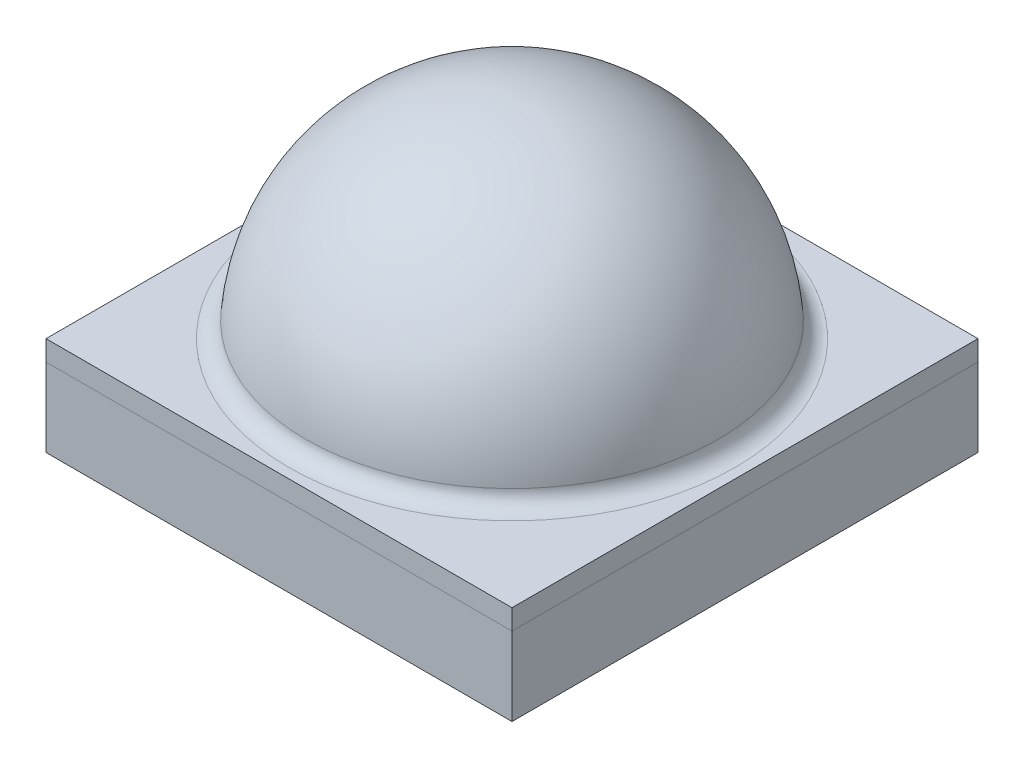
ISO-10303-21;
HEADER;
FILE_DESCRIPTION(('STEP AP214'),'2;1');
FILE_NAME('part.step','',(''),(''),'','','');
FILE_SCHEMA(('AUTOMOTIVE_DESIGN { 1 0 10303 214 1 1 1 1 }'));
ENDSEC;
DATA;
#1=APPLICATION_CONTEXT('core data for automotive mechanical design processes');
#2=APPLICATION_PROTOCOL_DEFINITION('international standard','automotive_design',2000,#1);
#3=PRODUCT_CONTEXT('',#1,'mechanical');
#4=PRODUCT('Part','Part','',(#3));
#5=PRODUCT_RELATED_PRODUCT_CATEGORY('part','',(#4));
#6=PRODUCT_DEFINITION_FORMATION('','',#4);
#7=PRODUCT_DEFINITION_CONTEXT('part definition',#1,'design');
#8=PRODUCT_DEFINITION('design','',#6,#7);
#9=PRODUCT_DEFINITION_SHAPE('','',#8);
#10=(LENGTH_UNIT() NAMED_UNIT(*) SI_UNIT(.MILLI.,.METRE.));
#11=(NAMED_UNIT(*) PLANE_ANGLE_UNIT() SI_UNIT($,.RADIAN.));
#12=(NAMED_UNIT(*) SI_UNIT($,.STERADIAN.) SOLID_ANGLE_UNIT());
#13=UNCERTAINTY_MEASURE_WITH_UNIT(LENGTH_MEASURE(1.E-05),#10,'distance_accuracy_value','');
#14=(GEOMETRIC_REPRESENTATION_CONTEXT(3) GLOBAL_UNCERTAINTY_ASSIGNED_CONTEXT((#13)) GLOBAL_UNIT_ASSIGNED_CONTEXT((#10,
#11,#12)) REPRESENTATION_CONTEXT('',''));
#15=CARTESIAN_POINT('',(0.,0.,0.));
#16=DIRECTION('',(0.,0.,1.));
#17=DIRECTION('',(1.,0.,0.));
#18=AXIS2_PLACEMENT_3D('',#15,#16,#17);
#19=CARTESIAN_POINT('',(1.725,0.73,-1.725));
#20=DIRECTION('',(-1.,0.,0.));
#21=DIRECTION('',(0.,0.,1.));
#22=AXIS2_PLACEMENT_3D('',#19,#20,#21);
#23=PLANE('',#22);
#24=DIRECTION('',(0.,0.,-1.));
#25=VECTOR('',#24,1.);
#26=CARTESIAN_POINT('',(1.725,0.58,-1.725));
#27=LINE('',#26,#25);
#28=CARTESIAN_POINT('',(1.725,0.58,1.725));
#29=VERTEX_POINT('',#28);
#30=CARTESIAN_POINT('',(1.725,0.58,-1.725));
#31=VERTEX_POINT('',#30);
#32=EDGE_CURVE('E115',#29,#31,#27,.T.);
#33=ORIENTED_EDGE('',*,*,#32,.T.);
#34=DIRECTION('',(0.,-1.,0.));
#35=VECTOR('',#34,1.);
#36=CARTESIAN_POINT('',(1.725,0.73,-1.725));
#37=LINE('',#36,#35);
#38=CARTESIAN_POINT('',(1.725,0.73,-1.725));
#39=VERTEX_POINT('',#38);
#40=EDGE_CURVE('E106',#39,#31,#37,.T.);
#41=ORIENTED_EDGE('',*,*,#40,.F.);
#42=DIRECTION('',(0.,0.,-1.));
#43=VECTOR('',#42,1.);
#44=CARTESIAN_POINT('',(1.725,0.73,-1.725));
#45=LINE('',#44,#43);
#46=CARTESIAN_POINT('',(1.725,0.73,1.725));
#47=VERTEX_POINT('',#46);
#48=EDGE_CURVE('E100',#47,#39,#45,.T.);
#49=ORIENTED_EDGE('',*,*,#48,.F.);
#50=DIRECTION('',(0.,-1.,0.));
#51=VECTOR('',#50,1.);
#52=CARTESIAN_POINT('',(1.725,0.73,1.725));
#53=LINE('',#52,#51);
#54=EDGE_CURVE('E111',#47,#29,#53,.T.);
#55=ORIENTED_EDGE('',*,*,#54,.T.);
#56=EDGE_LOOP('',(#33,#41,#49,#55));
#57=FACE_BOUND('',#56,.T.);
#58=ADVANCED_FACE('F47',(#57),#23,.F.);
#59=CARTESIAN_POINT('',(-1.725,0.73,-1.725));
#60=DIRECTION('',(0.,0.,1.));
#61=DIRECTION('',(1.,0.,0.));
#62=AXIS2_PLACEMENT_3D('',#59,#60,#61);
#63=PLANE('',#62);
#64=DIRECTION('',(-1.,0.,0.));
#65=VECTOR('',#64,1.);
#66=CARTESIAN_POINT('',(-1.725,0.58,-1.725));
#67=LINE('',#66,#65);
#68=CARTESIAN_POINT('',(-1.725,0.58,-1.725));
#69=VERTEX_POINT('',#68);
#70=EDGE_CURVE('E105',#31,#69,#67,.T.);
#71=ORIENTED_EDGE('',*,*,#70,.T.);
#72=DIRECTION('',(0.,-1.,0.));
#73=VECTOR('',#72,1.);
#74=CARTESIAN_POINT('',(-1.725,0.73,-1.725));
#75=LINE('',#74,#73);
#76=CARTESIAN_POINT('',(-1.725,0.73,-1.725));
#77=VERTEX_POINT('',#76);
#78=EDGE_CURVE('E103',#77,#69,#75,.T.);
#79=ORIENTED_EDGE('',*,*,#78,.F.);
#80=DIRECTION('',(-1.,0.,0.));
#81=VECTOR('',#80,1.);
#82=CARTESIAN_POINT('',(-1.725,0.73,-1.725));
#83=LINE('',#82,#81);
#84=EDGE_CURVE('E95',#39,#77,#83,.T.);
#85=ORIENTED_EDGE('',*,*,#84,.F.);
#86=ORIENTED_EDGE('',*,*,#40,.T.);
#87=EDGE_LOOP('',(#71,#79,#85,#86));
#88=FACE_BOUND('',#87,.T.);
#89=ADVANCED_FACE('F104',(#88),#63,.F.);
#90=CARTESIAN_POINT('',(-1.725,0.73,-1.725));
#91=DIRECTION('',(1.,0.,0.));
#92=DIRECTION('',(0.,0.,-1.));
#93=AXIS2_PLACEMENT_3D('',#90,#91,#92);
#94=PLANE('',#93);
#95=DIRECTION('',(0.,0.,1.));
#96=VECTOR('',#95,1.);
#97=CARTESIAN_POINT('',(-1.725,0.58,-1.725));
#98=LINE('',#97,#96);
#99=CARTESIAN_POINT('',(-1.725,0.58,1.725));
#100=VERTEX_POINT('',#99);
#101=EDGE_CURVE('E81',#69,#100,#98,.T.);
#102=ORIENTED_EDGE('',*,*,#101,.T.);
#103=DIRECTION('',(0.,-1.,0.));
#104=VECTOR('',#103,1.);
#105=CARTESIAN_POINT('',(-1.725,0.73,1.725));
#106=LINE('',#105,#104);
#107=CARTESIAN_POINT('',(-1.725,0.73,1.725));
#108=VERTEX_POINT('',#107);
#109=EDGE_CURVE('E107',#108,#100,#106,.T.);
#110=ORIENTED_EDGE('',*,*,#109,.F.);
#111=DIRECTION('',(0.,0.,1.));
#112=VECTOR('',#111,1.);
#113=CARTESIAN_POINT('',(-1.725,0.73,-1.725));
#114=LINE('',#113,#112);
#115=EDGE_CURVE('E98',#77,#108,#114,.T.);
#116=ORIENTED_EDGE('',*,*,#115,.F.);
#117=ORIENTED_EDGE('',*,*,#78,.T.);
#118=EDGE_LOOP('',(#102,#110,#116,#117));
#119=FACE_BOUND('',#118,.T.);
#120=ADVANCED_FACE('F109',(#119),#94,.F.);
#121=CARTESIAN_POINT('',(-1.725,0.73,1.725));
#122=DIRECTION('',(0.,0.,-1.));
#123=DIRECTION('',(-1.,0.,0.));
#124=AXIS2_PLACEMENT_3D('',#121,#122,#123);
#125=PLANE('',#124);
#126=DIRECTION('',(1.,0.,0.));
#127=VECTOR('',#126,1.);
#128=CARTESIAN_POINT('',(-1.725,0.58,1.725));
#129=LINE('',#128,#127);
#130=EDGE_CURVE('E87',#100,#29,#129,.T.);
#131=ORIENTED_EDGE('',*,*,#130,.T.);
#132=ORIENTED_EDGE('',*,*,#54,.F.);
#133=DIRECTION('',(1.,0.,0.));
#134=VECTOR('',#133,1.);
#135=CARTESIAN_POINT('',(-1.725,0.73,1.725));
#136=LINE('',#135,#134);
#137=EDGE_CURVE('E64',#108,#47,#136,.T.);
#138=ORIENTED_EDGE('',*,*,#137,.F.);
#139=ORIENTED_EDGE('',*,*,#109,.T.);
#140=EDGE_LOOP('',(#131,#132,#138,#139));
#141=FACE_BOUND('',#140,.T.);
#142=ADVANCED_FACE('F145',(#141),#125,.F.);
#143=CARTESIAN_POINT('',(0.,0.73,0.));
#144=DIRECTION('',(0.,1.,0.));
#145=DIRECTION('',(0.,0.,1.));
#146=AXIS2_PLACEMENT_3D('',#143,#144,#145);
#147=PLANE('',#146);
#148=CARTESIAN_POINT('',(0.,0.73,0.));
#149=DIRECTION('',(0.,1.,0.));
#150=DIRECTION('',(0.,0.,1.));
#151=AXIS2_PLACEMENT_3D('',#148,#149,#150);
#152=CIRCLE('',#151,1.65212590319261);
#153=CARTESIAN_POINT('',(0.,0.73,1.65212590319261));
#154=VERTEX_POINT('',#153);
#155=EDGE_CURVE('E12',#154,#154,#152,.F.);
#156=ORIENTED_EDGE('',*,*,#155,.T.);
#157=EDGE_LOOP('',(#156));
#158=FACE_BOUND('',#157,.T.);
#159=ORIENTED_EDGE('',*,*,#48,.T.);
#160=ORIENTED_EDGE('',*,*,#84,.T.);
#161=ORIENTED_EDGE('',*,*,#115,.T.);
#162=ORIENTED_EDGE('',*,*,#137,.T.);
#163=EDGE_LOOP('',(#159,#160,#161,#162));
#164=FACE_BOUND('',#163,.T.);
#165=ADVANCED_FACE('F96',(#158,#164),#147,.T.);
#166=CARTESIAN_POINT('',(0.,0.58,0.));
#167=DIRECTION('',(0.,1.,0.));
#168=DIRECTION('',(0.,0.,1.));
#169=AXIS2_PLACEMENT_3D('',#166,#167,#168);
#170=PLANE('',#169);
#171=ORIENTED_EDGE('',*,*,#32,.F.);
#172=ORIENTED_EDGE('',*,*,#130,.F.);
#173=ORIENTED_EDGE('',*,*,#101,.F.);
#174=ORIENTED_EDGE('',*,*,#70,.F.);
#175=EDGE_LOOP('',(#171,#172,#173,#174));
#176=FACE_BOUND('',#175,.T.);
#177=ADVANCED_FACE('F133',(#176),#170,.F.);
#178=CARTESIAN_POINT('',(0.,0.73,0.));
#179=DIRECTION('',(0.,1.,0.));
#180=DIRECTION('',(0.,0.,-1.));
#181=AXIS2_PLACEMENT_3D('',#178,#179,#180);
#182=SPHERICAL_SURFACE('',#181,1.53);
#183=CARTESIAN_POINT('',(0.,0.847266143633072,0.));
#184=DIRECTION('',(0.,-1.,0.));
#185=DIRECTION('',(0.,0.,-1.));
#186=AXIS2_PLACEMENT_3D('',#183,#184,#185);
#187=CIRCLE('',#186,1.52549947609215);
#188=CARTESIAN_POINT('',(0.,0.847266143633072,-1.52549947609215));
#189=VERTEX_POINT('',#188);
#190=EDGE_CURVE('E56',#189,#189,#187,.F.);
#191=ORIENTED_EDGE('',*,*,#190,.T.);
#192=EDGE_LOOP('',(#191));
#193=FACE_BOUND('',#192,.T.);
#194=ADVANCED_FACE('F126',(#193),#182,.T.);
#195=CARTESIAN_POINT('',(0.,0.857,0.));
#196=DIRECTION('',(0.,1.,0.));
#197=DIRECTION('',(0.,0.,1.));
#198=AXIS2_PLACEMENT_3D('',#195,#196,#197);
#199=TOROIDAL_SURFACE('',#198,1.65212590319261,0.127);
#200=ORIENTED_EDGE('',*,*,#155,.F.);
#201=EDGE_LOOP('',(#200));
#202=FACE_BOUND('',#201,.T.);
#203=ORIENTED_EDGE('',*,*,#190,.F.);
#204=EDGE_LOOP('',(#203));
#205=FACE_BOUND('',#204,.T.);
#206=ADVANCED_FACE('F49',(#202,#205),#199,.F.);
#207=CLOSED_SHELL('',(#58,#89,#120,#142,#165,#177,#194,#206));
#208=MANIFOLD_SOLID_BREP('B2',#207);
#209=CARTESIAN_POINT('',(1.725,0.58,-1.725));
#210=DIRECTION('',(-1.,0.,0.));
#211=DIRECTION('',(0.,0.,1.));
#212=AXIS2_PLACEMENT_3D('',#209,#210,#211);
#213=PLANE('',#212);
#214=DIRECTION('',(0.,0.,-1.));
#215=VECTOR('',#214,1.);
#216=CARTESIAN_POINT('',(1.725,0.,-1.725));
#217=LINE('',#216,#215);
#218=CARTESIAN_POINT('',(1.725,0.,1.725));
#219=VERTEX_POINT('',#218);
#220=CARTESIAN_POINT('',(1.725,0.,-1.725));
#221=VERTEX_POINT('',#220);
#222=EDGE_CURVE('E264',#219,#221,#217,.T.);
#223=ORIENTED_EDGE('',*,*,#222,.T.);
#224=DIRECTION('',(0.,-1.,0.));
#225=VECTOR('',#224,1.);
#226=CARTESIAN_POINT('',(1.725,0.58,-1.725));
#227=LINE('',#226,#225);
#228=CARTESIAN_POINT('',(1.725,0.58,-1.725));
#229=VERTEX_POINT('',#228);
#230=EDGE_CURVE('E45',#229,#221,#227,.T.);
#231=ORIENTED_EDGE('',*,*,#230,.F.);
#232=DIRECTION('',(0.,0.,-1.));
#233=VECTOR('',#232,1.);
#234=CARTESIAN_POINT('',(1.725,0.58,-1.725));
#235=LINE('',#234,#233);
#236=CARTESIAN_POINT('',(1.725,0.58,1.725));
#237=VERTEX_POINT('',#236);
#238=EDGE_CURVE('E252',#237,#229,#235,.T.);
#239=ORIENTED_EDGE('',*,*,#238,.F.);
#240=DIRECTION('',(0.,-1.,0.));
#241=VECTOR('',#240,1.);
#242=CARTESIAN_POINT('',(1.725,0.58,1.725));
#243=LINE('',#242,#241);
#244=EDGE_CURVE('E260',#237,#219,#243,.T.);
#245=ORIENTED_EDGE('',*,*,#244,.T.);
#246=EDGE_LOOP('',(#223,#231,#239,#245));
#247=FACE_BOUND('',#246,.T.);
#248=ADVANCED_FACE('F201',(#247),#213,.F.);
#249=CARTESIAN_POINT('',(-1.725,0.58,-1.725));
#250=DIRECTION('',(0.,0.,1.));
#251=DIRECTION('',(1.,0.,0.));
#252=AXIS2_PLACEMENT_3D('',#249,#250,#251);
#253=PLANE('',#252);
#254=DIRECTION('',(-1.,0.,0.));
#255=VECTOR('',#254,1.);
#256=CARTESIAN_POINT('',(-1.725,0.,-1.725));
#257=LINE('',#256,#255);
#258=CARTESIAN_POINT('',(-1.725,0.,-1.725));
#259=VERTEX_POINT('',#258);
#260=EDGE_CURVE('E256',#221,#259,#257,.T.);
#261=ORIENTED_EDGE('',*,*,#260,.T.);
#262=DIRECTION('',(0.,-1.,0.));
#263=VECTOR('',#262,1.);
#264=CARTESIAN_POINT('',(-1.725,0.58,-1.725));
#265=LINE('',#264,#263);
#266=CARTESIAN_POINT('',(-1.725,0.58,-1.725));
#267=VERTEX_POINT('',#266);
#268=EDGE_CURVE('E209',#267,#259,#265,.T.);
#269=ORIENTED_EDGE('',*,*,#268,.F.);
#270=DIRECTION('',(-1.,0.,0.));
#271=VECTOR('',#270,1.);
#272=CARTESIAN_POINT('',(-1.725,0.58,-1.725));
#273=LINE('',#272,#271);
#274=EDGE_CURVE('E247',#229,#267,#273,.T.);
#275=ORIENTED_EDGE('',*,*,#274,.F.);
#276=ORIENTED_EDGE('',*,*,#230,.T.);
#277=EDGE_LOOP('',(#261,#269,#275,#276));
#278=FACE_BOUND('',#277,.T.);
#279=ADVANCED_FACE('F255',(#278),#253,.F.);
#280=CARTESIAN_POINT('',(-1.725,0.58,-1.725));
#281=DIRECTION('',(1.,0.,0.));
#282=DIRECTION('',(0.,0.,-1.));
#283=AXIS2_PLACEMENT_3D('',#280,#281,#282);
#284=PLANE('',#283);
#285=DIRECTION('',(0.,0.,1.));
#286=VECTOR('',#285,1.);
#287=CARTESIAN_POINT('',(-1.725,0.,-1.725));
#288=LINE('',#287,#286);
#289=CARTESIAN_POINT('',(-1.725,0.,1.725));
#290=VERTEX_POINT('',#289);
#291=EDGE_CURVE('E234',#259,#290,#288,.T.);
#292=ORIENTED_EDGE('',*,*,#291,.T.);
#293=DIRECTION('',(0.,-1.,0.));
#294=VECTOR('',#293,1.);
#295=CARTESIAN_POINT('',(-1.725,0.58,1.725));
#296=LINE('',#295,#294);
#297=CARTESIAN_POINT('',(-1.725,0.58,1.725));
#298=VERTEX_POINT('',#297);
#299=EDGE_CURVE('E257',#298,#290,#296,.T.);
#300=ORIENTED_EDGE('',*,*,#299,.F.);
#301=DIRECTION('',(0.,0.,1.));
#302=VECTOR('',#301,1.);
#303=CARTESIAN_POINT('',(-1.725,0.58,-1.725));
#304=LINE('',#303,#302);
#305=EDGE_CURVE('E250',#267,#298,#304,.T.);
#306=ORIENTED_EDGE('',*,*,#305,.F.);
#307=ORIENTED_EDGE('',*,*,#268,.T.);
#308=EDGE_LOOP('',(#292,#300,#306,#307));
#309=FACE_BOUND('',#308,.T.);
#310=ADVANCED_FACE('F258',(#309),#284,.F.);
#311=CARTESIAN_POINT('',(-1.725,0.58,1.725));
#312=DIRECTION('',(0.,0.,-1.));
#313=DIRECTION('',(-1.,0.,0.));
#314=AXIS2_PLACEMENT_3D('',#311,#312,#313);
#315=PLANE('',#314);
#316=DIRECTION('',(1.,0.,0.));
#317=VECTOR('',#316,1.);
#318=CARTESIAN_POINT('',(-1.725,0.,1.725));
#319=LINE('',#318,#317);
#320=EDGE_CURVE('E240',#290,#219,#319,.T.);
#321=ORIENTED_EDGE('',*,*,#320,.T.);
#322=ORIENTED_EDGE('',*,*,#244,.F.);
#323=DIRECTION('',(1.,0.,0.));
#324=VECTOR('',#323,1.);
#325=CARTESIAN_POINT('',(-1.725,0.58,1.725));
#326=LINE('',#325,#324);
#327=EDGE_CURVE('E217',#298,#237,#326,.T.);
#328=ORIENTED_EDGE('',*,*,#327,.F.);
#329=ORIENTED_EDGE('',*,*,#299,.T.);
#330=EDGE_LOOP('',(#321,#322,#328,#329));
#331=FACE_BOUND('',#330,.T.);
#332=ADVANCED_FACE('F271',(#331),#315,.F.);
#333=CARTESIAN_POINT('',(0.,0.58,0.));
#334=DIRECTION('',(0.,1.,0.));
#335=DIRECTION('',(0.,0.,1.));
#336=AXIS2_PLACEMENT_3D('',#333,#334,#335);
#337=PLANE('',#336);
#338=ORIENTED_EDGE('',*,*,#238,.T.);
#339=ORIENTED_EDGE('',*,*,#274,.T.);
#340=ORIENTED_EDGE('',*,*,#305,.T.);
#341=ORIENTED_EDGE('',*,*,#327,.T.);
#342=EDGE_LOOP('',(#338,#339,#340,#341));
#343=FACE_BOUND('',#342,.T.);
#344=ADVANCED_FACE('F248',(#343),#337,.T.);
#345=CARTESIAN_POINT('',(0.,0.,0.));
#346=DIRECTION('',(0.,1.,0.));
#347=DIRECTION('',(0.,0.,1.));
#348=AXIS2_PLACEMENT_3D('',#345,#346,#347);
#349=PLANE('',#348);
#350=ORIENTED_EDGE('',*,*,#222,.F.);
#351=ORIENTED_EDGE('',*,*,#320,.F.);
#352=ORIENTED_EDGE('',*,*,#291,.F.);
#353=ORIENTED_EDGE('',*,*,#260,.F.);
#354=EDGE_LOOP('',(#350,#351,#352,#353));
#355=FACE_BOUND('',#354,.T.);
#356=ADVANCED_FACE('F274',(#355),#349,.F.);
#357=CLOSED_SHELL('',(#248,#279,#310,#332,#344,#356));
#358=MANIFOLD_SOLID_BREP('B6',#357);
#359=ADVANCED_BREP_SHAPE_REPRESENTATION('',(#18,#208,#358),#14);
#360=SHAPE_DEFINITION_REPRESENTATION(#9,#359);
ENDSEC;
END-ISO-10303-21;
